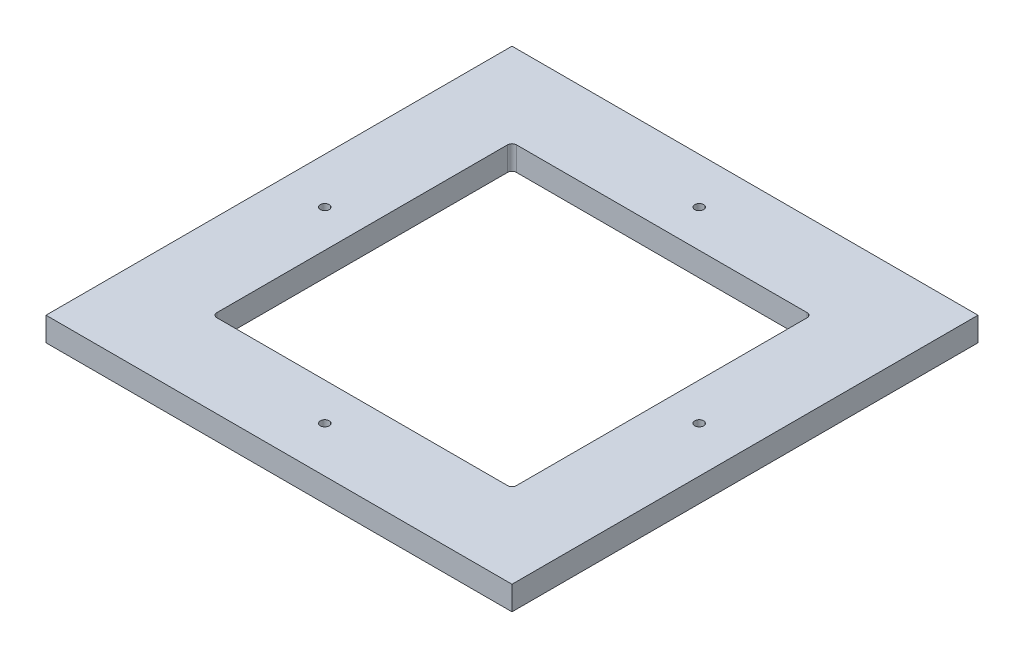
ISO-10303-21;
HEADER;
FILE_DESCRIPTION(('STEP AP214'),'2;1');
FILE_NAME('part.step','',(''),(''),'','','');
FILE_SCHEMA(('AUTOMOTIVE_DESIGN { 1 0 10303 214 1 1 1 1 }'));
ENDSEC;
DATA;
#1=APPLICATION_CONTEXT('core data for automotive mechanical design processes');
#2=APPLICATION_PROTOCOL_DEFINITION('international standard','automotive_design',2000,#1);
#3=PRODUCT_CONTEXT('',#1,'mechanical');
#4=PRODUCT('Part','Part','',(#3));
#5=PRODUCT_RELATED_PRODUCT_CATEGORY('part','',(#4));
#6=PRODUCT_DEFINITION_FORMATION('','',#4);
#7=PRODUCT_DEFINITION_CONTEXT('part definition',#1,'design');
#8=PRODUCT_DEFINITION('design','',#6,#7);
#9=PRODUCT_DEFINITION_SHAPE('','',#8);
#10=(LENGTH_UNIT() NAMED_UNIT(*) SI_UNIT(.MILLI.,.METRE.));
#11=(NAMED_UNIT(*) PLANE_ANGLE_UNIT() SI_UNIT($,.RADIAN.));
#12=(NAMED_UNIT(*) SI_UNIT($,.STERADIAN.) SOLID_ANGLE_UNIT());
#13=UNCERTAINTY_MEASURE_WITH_UNIT(LENGTH_MEASURE(1.E-05),#10,'distance_accuracy_value','');
#14=(GEOMETRIC_REPRESENTATION_CONTEXT(3) GLOBAL_UNCERTAINTY_ASSIGNED_CONTEXT((#13)) GLOBAL_UNIT_ASSIGNED_CONTEXT((#10,
#11,#12)) REPRESENTATION_CONTEXT('',''));
#15=CARTESIAN_POINT('',(0.,0.,0.));
#16=DIRECTION('',(0.,0.,1.));
#17=DIRECTION('',(1.,0.,0.));
#18=AXIS2_PLACEMENT_3D('',#15,#16,#17);
#19=CARTESIAN_POINT('',(177.8,18.25625,-177.8));
#20=DIRECTION('',(-1.,0.,0.));
#21=DIRECTION('',(0.,0.,1.));
#22=AXIS2_PLACEMENT_3D('',#19,#20,#21);
#23=PLANE('',#22);
#24=DIRECTION('',(0.,0.,-1.));
#25=VECTOR('',#24,1.);
#26=CARTESIAN_POINT('',(177.8,0.,-177.8));
#27=LINE('',#26,#25);
#28=CARTESIAN_POINT('',(177.8,0.,177.8));
#29=VERTEX_POINT('',#28);
#30=CARTESIAN_POINT('',(177.8,0.,-177.8));
#31=VERTEX_POINT('',#30);
#32=EDGE_CURVE('E146',#29,#31,#27,.T.);
#33=ORIENTED_EDGE('',*,*,#32,.T.);
#34=DIRECTION('',(0.,-1.,0.));
#35=VECTOR('',#34,1.);
#36=CARTESIAN_POINT('',(177.8,18.25625,-177.8));
#37=LINE('',#36,#35);
#38=CARTESIAN_POINT('',(177.8,18.25625,-177.8));
#39=VERTEX_POINT('',#38);
#40=EDGE_CURVE('E127',#39,#31,#37,.T.);
#41=ORIENTED_EDGE('',*,*,#40,.F.);
#42=DIRECTION('',(0.,0.,-1.));
#43=VECTOR('',#42,1.);
#44=CARTESIAN_POINT('',(177.8,18.25625,-177.8));
#45=LINE('',#44,#43);
#46=CARTESIAN_POINT('',(177.8,18.25625,177.8));
#47=VERTEX_POINT('',#46);
#48=EDGE_CURVE('E134',#47,#39,#45,.T.);
#49=ORIENTED_EDGE('',*,*,#48,.F.);
#50=DIRECTION('',(0.,-1.,0.));
#51=VECTOR('',#50,1.);
#52=CARTESIAN_POINT('',(177.8,18.25625,177.8));
#53=LINE('',#52,#51);
#54=EDGE_CURVE('E245',#47,#29,#53,.T.);
#55=ORIENTED_EDGE('',*,*,#54,.T.);
#56=EDGE_LOOP('',(#33,#41,#49,#55));
#57=FACE_BOUND('',#56,.T.);
#58=ADVANCED_FACE('F33',(#57),#23,.F.);
#59=CARTESIAN_POINT('',(-177.8,18.25625,-177.8));
#60=DIRECTION('',(0.,0.,1.));
#61=DIRECTION('',(1.,0.,0.));
#62=AXIS2_PLACEMENT_3D('',#59,#60,#61);
#63=PLANE('',#62);
#64=DIRECTION('',(-1.,0.,0.));
#65=VECTOR('',#64,1.);
#66=CARTESIAN_POINT('',(-177.8,0.,-177.8));
#67=LINE('',#66,#65);
#68=CARTESIAN_POINT('',(-177.8,0.,-177.8));
#69=VERTEX_POINT('',#68);
#70=EDGE_CURVE('E247',#31,#69,#67,.T.);
#71=ORIENTED_EDGE('',*,*,#70,.T.);
#72=DIRECTION('',(0.,-1.,0.));
#73=VECTOR('',#72,1.);
#74=CARTESIAN_POINT('',(-177.8,18.25625,-177.8));
#75=LINE('',#74,#73);
#76=CARTESIAN_POINT('',(-177.8,18.25625,-177.8));
#77=VERTEX_POINT('',#76);
#78=EDGE_CURVE('E130',#77,#69,#75,.T.);
#79=ORIENTED_EDGE('',*,*,#78,.F.);
#80=DIRECTION('',(-1.,0.,0.));
#81=VECTOR('',#80,1.);
#82=CARTESIAN_POINT('',(-177.8,18.25625,-177.8));
#83=LINE('',#82,#81);
#84=EDGE_CURVE('E123',#39,#77,#83,.T.);
#85=ORIENTED_EDGE('',*,*,#84,.F.);
#86=ORIENTED_EDGE('',*,*,#40,.T.);
#87=EDGE_LOOP('',(#71,#79,#85,#86));
#88=FACE_BOUND('',#87,.T.);
#89=ADVANCED_FACE('F125',(#88),#63,.F.);
#90=CARTESIAN_POINT('',(-177.8,18.25625,-177.8));
#91=DIRECTION('',(1.,0.,0.));
#92=DIRECTION('',(0.,0.,-1.));
#93=AXIS2_PLACEMENT_3D('',#90,#91,#92);
#94=PLANE('',#93);
#95=DIRECTION('',(0.,0.,1.));
#96=VECTOR('',#95,1.);
#97=CARTESIAN_POINT('',(-177.8,0.,-177.8));
#98=LINE('',#97,#96);
#99=CARTESIAN_POINT('',(-177.8,0.,177.8));
#100=VERTEX_POINT('',#99);
#101=EDGE_CURVE('E249',#69,#100,#98,.T.);
#102=ORIENTED_EDGE('',*,*,#101,.T.);
#103=DIRECTION('',(0.,-1.,0.));
#104=VECTOR('',#103,1.);
#105=CARTESIAN_POINT('',(-177.8,18.25625,177.8));
#106=LINE('',#105,#104);
#107=CARTESIAN_POINT('',(-177.8,18.25625,177.8));
#108=VERTEX_POINT('',#107);
#109=EDGE_CURVE('E151',#108,#100,#106,.T.);
#110=ORIENTED_EDGE('',*,*,#109,.F.);
#111=DIRECTION('',(0.,0.,1.));
#112=VECTOR('',#111,1.);
#113=CARTESIAN_POINT('',(-177.8,18.25625,-177.8));
#114=LINE('',#113,#112);
#115=EDGE_CURVE('E133',#77,#108,#114,.T.);
#116=ORIENTED_EDGE('',*,*,#115,.F.);
#117=ORIENTED_EDGE('',*,*,#78,.T.);
#118=EDGE_LOOP('',(#102,#110,#116,#117));
#119=FACE_BOUND('',#118,.T.);
#120=ADVANCED_FACE('F260',(#119),#94,.F.);
#121=CARTESIAN_POINT('',(-177.8,18.25625,177.8));
#122=DIRECTION('',(0.,0.,-1.));
#123=DIRECTION('',(-1.,0.,0.));
#124=AXIS2_PLACEMENT_3D('',#121,#122,#123);
#125=PLANE('',#124);
#126=DIRECTION('',(1.,0.,0.));
#127=VECTOR('',#126,1.);
#128=CARTESIAN_POINT('',(-177.8,0.,177.8));
#129=LINE('',#128,#127);
#130=EDGE_CURVE('E143',#100,#29,#129,.T.);
#131=ORIENTED_EDGE('',*,*,#130,.T.);
#132=ORIENTED_EDGE('',*,*,#54,.F.);
#133=DIRECTION('',(1.,0.,0.));
#134=VECTOR('',#133,1.);
#135=CARTESIAN_POINT('',(-177.8,18.25625,177.8));
#136=LINE('',#135,#134);
#137=EDGE_CURVE('E139',#108,#47,#136,.T.);
#138=ORIENTED_EDGE('',*,*,#137,.F.);
#139=ORIENTED_EDGE('',*,*,#109,.T.);
#140=EDGE_LOOP('',(#131,#132,#138,#139));
#141=FACE_BOUND('',#140,.T.);
#142=ADVANCED_FACE('F256',(#141),#125,.F.);
#143=CARTESIAN_POINT('',(0.,18.25625,0.));
#144=DIRECTION('',(0.,1.,0.));
#145=DIRECTION('',(0.,0.,1.));
#146=AXIS2_PLACEMENT_3D('',#143,#144,#145);
#147=PLANE('',#146);
#148=DIRECTION('',(0.,0.,1.));
#149=VECTOR('',#148,1.);
#150=CARTESIAN_POINT('',(-114.3,18.25625,114.3));
#151=LINE('',#150,#149);
#152=CARTESIAN_POINT('',(-114.3,18.25625,-110.9218));
#153=VERTEX_POINT('',#152);
#154=CARTESIAN_POINT('',(-114.3,18.25625,110.9218));
#155=VERTEX_POINT('',#154);
#156=EDGE_CURVE('E185',#153,#155,#151,.T.);
#157=ORIENTED_EDGE('',*,*,#156,.F.);
#158=CARTESIAN_POINT('',(-110.9218,18.25625,-110.9218));
#159=DIRECTION('',(0.,1.,0.));
#160=DIRECTION('',(0.,0.,1.));
#161=AXIS2_PLACEMENT_3D('',#158,#159,#160);
#162=CIRCLE('',#161,3.3782);
#163=CARTESIAN_POINT('',(-110.9218,18.25625,-114.3));
#164=VERTEX_POINT('',#163);
#165=EDGE_CURVE('E179',#153,#164,#162,.F.);
#166=ORIENTED_EDGE('',*,*,#165,.T.);
#167=DIRECTION('',(-1.,0.,0.));
#168=VECTOR('',#167,1.);
#169=CARTESIAN_POINT('',(114.3,18.25625,-114.3));
#170=LINE('',#169,#168);
#171=CARTESIAN_POINT('',(110.9218,18.25625,-114.3));
#172=VERTEX_POINT('',#171);
#173=EDGE_CURVE('E209',#172,#164,#170,.T.);
#174=ORIENTED_EDGE('',*,*,#173,.F.);
#175=CARTESIAN_POINT('',(110.9218,18.25625,-110.9218));
#176=DIRECTION('',(0.,1.,0.));
#177=DIRECTION('',(0.,0.,1.));
#178=AXIS2_PLACEMENT_3D('',#175,#176,#177);
#179=CIRCLE('',#178,3.3782);
#180=CARTESIAN_POINT('',(114.3,18.25625,-110.9218));
#181=VERTEX_POINT('',#180);
#182=EDGE_CURVE('E171',#172,#181,#179,.F.);
#183=ORIENTED_EDGE('',*,*,#182,.T.);
#184=DIRECTION('',(0.,0.,-1.));
#185=VECTOR('',#184,1.);
#186=CARTESIAN_POINT('',(114.3,18.25625,114.3));
#187=LINE('',#186,#185);
#188=CARTESIAN_POINT('',(114.3,18.25625,110.9218));
#189=VERTEX_POINT('',#188);
#190=EDGE_CURVE('E215',#189,#181,#187,.T.);
#191=ORIENTED_EDGE('',*,*,#190,.F.);
#192=CARTESIAN_POINT('',(110.9218,18.25625,110.9218));
#193=DIRECTION('',(0.,1.,0.));
#194=DIRECTION('',(0.,0.,1.));
#195=AXIS2_PLACEMENT_3D('',#192,#193,#194);
#196=CIRCLE('',#195,3.3782);
#197=CARTESIAN_POINT('',(110.9218,18.25625,114.3));
#198=VERTEX_POINT('',#197);
#199=EDGE_CURVE('E175',#189,#198,#196,.F.);
#200=ORIENTED_EDGE('',*,*,#199,.T.);
#201=DIRECTION('',(1.,0.,0.));
#202=VECTOR('',#201,1.);
#203=CARTESIAN_POINT('',(114.3,18.25625,114.3));
#204=LINE('',#203,#202);
#205=CARTESIAN_POINT('',(-110.9218,18.25625,114.3));
#206=VERTEX_POINT('',#205);
#207=EDGE_CURVE('E187',#206,#198,#204,.T.);
#208=ORIENTED_EDGE('',*,*,#207,.F.);
#209=CARTESIAN_POINT('',(-110.9218,18.25625,110.9218));
#210=DIRECTION('',(0.,1.,0.));
#211=DIRECTION('',(0.,0.,1.));
#212=AXIS2_PLACEMENT_3D('',#209,#210,#211);
#213=CIRCLE('',#212,3.3782);
#214=EDGE_CURVE('E41',#206,#155,#213,.F.);
#215=ORIENTED_EDGE('',*,*,#214,.T.);
#216=EDGE_LOOP('',(#157,#166,#174,#183,#191,#200,#208,#215));
#217=FACE_BOUND('',#216,.T.);
#218=CARTESIAN_POINT('',(0.,18.25625,-142.875));
#219=DIRECTION('',(0.,1.,0.));
#220=DIRECTION('',(0.,0.,1.));
#221=AXIS2_PLACEMENT_3D('',#218,#219,#220);
#222=CIRCLE('',#221,3.3782);
#223=CARTESIAN_POINT('',(0.,18.25625,-139.4968));
#224=VERTEX_POINT('',#223);
#225=EDGE_CURVE('E212',#224,#224,#222,.T.);
#226=ORIENTED_EDGE('',*,*,#225,.F.);
#227=EDGE_LOOP('',(#226));
#228=FACE_BOUND('',#227,.T.);
#229=CARTESIAN_POINT('',(-142.875,18.25625,0.));
#230=DIRECTION('',(0.,1.,0.));
#231=DIRECTION('',(0.,0.,1.));
#232=AXIS2_PLACEMENT_3D('',#229,#230,#231);
#233=CIRCLE('',#232,3.3782);
#234=CARTESIAN_POINT('',(-142.875,18.25625,3.3782));
#235=VERTEX_POINT('',#234);
#236=EDGE_CURVE('E225',#235,#235,#233,.T.);
#237=ORIENTED_EDGE('',*,*,#236,.F.);
#238=EDGE_LOOP('',(#237));
#239=FACE_BOUND('',#238,.T.);
#240=CARTESIAN_POINT('',(0.,18.25625,142.875));
#241=DIRECTION('',(0.,1.,0.));
#242=DIRECTION('',(0.,0.,1.));
#243=AXIS2_PLACEMENT_3D('',#240,#241,#242);
#244=CIRCLE('',#243,3.3782);
#245=CARTESIAN_POINT('',(0.,18.25625,146.2532));
#246=VERTEX_POINT('',#245);
#247=EDGE_CURVE('E231',#246,#246,#244,.T.);
#248=ORIENTED_EDGE('',*,*,#247,.F.);
#249=EDGE_LOOP('',(#248));
#250=FACE_BOUND('',#249,.T.);
#251=CARTESIAN_POINT('',(142.875,18.25625,0.));
#252=DIRECTION('',(0.,1.,0.));
#253=DIRECTION('',(0.,0.,1.));
#254=AXIS2_PLACEMENT_3D('',#251,#252,#253);
#255=CIRCLE('',#254,3.3782);
#256=CARTESIAN_POINT('',(142.875,18.25625,3.37819999999995));
#257=VERTEX_POINT('',#256);
#258=EDGE_CURVE('E237',#257,#257,#255,.T.);
#259=ORIENTED_EDGE('',*,*,#258,.F.);
#260=EDGE_LOOP('',(#259));
#261=FACE_BOUND('',#260,.T.);
#262=ORIENTED_EDGE('',*,*,#48,.T.);
#263=ORIENTED_EDGE('',*,*,#84,.T.);
#264=ORIENTED_EDGE('',*,*,#115,.T.);
#265=ORIENTED_EDGE('',*,*,#137,.T.);
#266=EDGE_LOOP('',(#262,#263,#264,#265));
#267=FACE_BOUND('',#266,.T.);
#268=ADVANCED_FACE('F137',(#217,#228,#239,#250,#261,#267),#147,.T.);
#269=CARTESIAN_POINT('',(0.,0.,0.));
#270=DIRECTION('',(0.,1.,0.));
#271=DIRECTION('',(0.,0.,1.));
#272=AXIS2_PLACEMENT_3D('',#269,#270,#271);
#273=PLANE('',#272);
#274=DIRECTION('',(0.,0.,-1.));
#275=VECTOR('',#274,1.);
#276=CARTESIAN_POINT('',(114.3,0.,114.3));
#277=LINE('',#276,#275);
#278=CARTESIAN_POINT('',(114.3,0.,110.9218));
#279=VERTEX_POINT('',#278);
#280=CARTESIAN_POINT('',(114.3,0.,-110.9218));
#281=VERTEX_POINT('',#280);
#282=EDGE_CURVE('E205',#279,#281,#277,.T.);
#283=ORIENTED_EDGE('',*,*,#282,.T.);
#284=CARTESIAN_POINT('',(110.9218,0.,-110.9218));
#285=DIRECTION('',(0.,1.,0.));
#286=DIRECTION('',(0.,0.,1.));
#287=AXIS2_PLACEMENT_3D('',#284,#285,#286);
#288=CIRCLE('',#287,3.3782);
#289=CARTESIAN_POINT('',(110.9218,0.,-114.3));
#290=VERTEX_POINT('',#289);
#291=EDGE_CURVE('E173',#281,#290,#288,.T.);
#292=ORIENTED_EDGE('',*,*,#291,.T.);
#293=DIRECTION('',(-1.,0.,0.));
#294=VECTOR('',#293,1.);
#295=CARTESIAN_POINT('',(114.3,0.,-114.3));
#296=LINE('',#295,#294);
#297=CARTESIAN_POINT('',(-110.9218,0.,-114.3));
#298=VERTEX_POINT('',#297);
#299=EDGE_CURVE('E207',#290,#298,#296,.T.);
#300=ORIENTED_EDGE('',*,*,#299,.T.);
#301=CARTESIAN_POINT('',(-110.9218,0.,-110.9218));
#302=DIRECTION('',(0.,1.,0.));
#303=DIRECTION('',(0.,0.,1.));
#304=AXIS2_PLACEMENT_3D('',#301,#302,#303);
#305=CIRCLE('',#304,3.3782);
#306=CARTESIAN_POINT('',(-114.3,0.,-110.9218));
#307=VERTEX_POINT('',#306);
#308=EDGE_CURVE('E55',#298,#307,#305,.T.);
#309=ORIENTED_EDGE('',*,*,#308,.T.);
#310=DIRECTION('',(0.,0.,1.));
#311=VECTOR('',#310,1.);
#312=CARTESIAN_POINT('',(-114.3,0.,114.3));
#313=LINE('',#312,#311);
#314=CARTESIAN_POINT('',(-114.3,0.,110.9218));
#315=VERTEX_POINT('',#314);
#316=EDGE_CURVE('E201',#307,#315,#313,.T.);
#317=ORIENTED_EDGE('',*,*,#316,.T.);
#318=CARTESIAN_POINT('',(-110.9218,0.,110.9218));
#319=DIRECTION('',(0.,1.,0.));
#320=DIRECTION('',(0.,0.,1.));
#321=AXIS2_PLACEMENT_3D('',#318,#319,#320);
#322=CIRCLE('',#321,3.3782);
#323=CARTESIAN_POINT('',(-110.9218,0.,114.3));
#324=VERTEX_POINT('',#323);
#325=EDGE_CURVE('E11',#315,#324,#322,.T.);
#326=ORIENTED_EDGE('',*,*,#325,.T.);
#327=DIRECTION('',(1.,0.,0.));
#328=VECTOR('',#327,1.);
#329=CARTESIAN_POINT('',(114.3,0.,114.3));
#330=LINE('',#329,#328);
#331=CARTESIAN_POINT('',(110.9218,0.,114.3));
#332=VERTEX_POINT('',#331);
#333=EDGE_CURVE('E199',#324,#332,#330,.T.);
#334=ORIENTED_EDGE('',*,*,#333,.T.);
#335=CARTESIAN_POINT('',(110.9218,0.,110.9218));
#336=DIRECTION('',(0.,1.,0.));
#337=DIRECTION('',(0.,0.,1.));
#338=AXIS2_PLACEMENT_3D('',#335,#336,#337);
#339=CIRCLE('',#338,3.3782);
#340=EDGE_CURVE('E177',#332,#279,#339,.T.);
#341=ORIENTED_EDGE('',*,*,#340,.T.);
#342=EDGE_LOOP('',(#283,#292,#300,#309,#317,#326,#334,#341));
#343=FACE_BOUND('',#342,.T.);
#344=CARTESIAN_POINT('',(0.,0.,-142.875));
#345=DIRECTION('',(0.,1.,0.));
#346=DIRECTION('',(0.,0.,1.));
#347=AXIS2_PLACEMENT_3D('',#344,#345,#346);
#348=CIRCLE('',#347,3.3782);
#349=CARTESIAN_POINT('',(0.,0.,-139.4968));
#350=VERTEX_POINT('',#349);
#351=EDGE_CURVE('E222',#350,#350,#348,.T.);
#352=ORIENTED_EDGE('',*,*,#351,.T.);
#353=EDGE_LOOP('',(#352));
#354=FACE_BOUND('',#353,.T.);
#355=CARTESIAN_POINT('',(-142.875,0.,0.));
#356=DIRECTION('',(0.,1.,0.));
#357=DIRECTION('',(0.,0.,1.));
#358=AXIS2_PLACEMENT_3D('',#355,#356,#357);
#359=CIRCLE('',#358,3.3782);
#360=CARTESIAN_POINT('',(-142.875,0.,3.3782));
#361=VERTEX_POINT('',#360);
#362=EDGE_CURVE('E228',#361,#361,#359,.T.);
#363=ORIENTED_EDGE('',*,*,#362,.T.);
#364=EDGE_LOOP('',(#363));
#365=FACE_BOUND('',#364,.T.);
#366=CARTESIAN_POINT('',(0.,0.,142.875));
#367=DIRECTION('',(0.,1.,0.));
#368=DIRECTION('',(0.,0.,1.));
#369=AXIS2_PLACEMENT_3D('',#366,#367,#368);
#370=CIRCLE('',#369,3.3782);
#371=CARTESIAN_POINT('',(0.,0.,146.2532));
#372=VERTEX_POINT('',#371);
#373=EDGE_CURVE('E234',#372,#372,#370,.T.);
#374=ORIENTED_EDGE('',*,*,#373,.T.);
#375=EDGE_LOOP('',(#374));
#376=FACE_BOUND('',#375,.T.);
#377=CARTESIAN_POINT('',(142.875,0.,0.));
#378=DIRECTION('',(0.,1.,0.));
#379=DIRECTION('',(0.,0.,1.));
#380=AXIS2_PLACEMENT_3D('',#377,#378,#379);
#381=CIRCLE('',#380,3.3782);
#382=CARTESIAN_POINT('',(142.875,0.,3.37819999999995));
#383=VERTEX_POINT('',#382);
#384=EDGE_CURVE('E240',#383,#383,#381,.T.);
#385=ORIENTED_EDGE('',*,*,#384,.T.);
#386=EDGE_LOOP('',(#385));
#387=FACE_BOUND('',#386,.T.);
#388=ORIENTED_EDGE('',*,*,#32,.F.);
#389=ORIENTED_EDGE('',*,*,#130,.F.);
#390=ORIENTED_EDGE('',*,*,#101,.F.);
#391=ORIENTED_EDGE('',*,*,#70,.F.);
#392=EDGE_LOOP('',(#388,#389,#390,#391));
#393=FACE_BOUND('',#392,.T.);
#394=ADVANCED_FACE('F197',(#343,#354,#365,#376,#387,#393),#273,.F.);
#395=CARTESIAN_POINT('',(142.875,18.25625,0.));
#396=DIRECTION('',(0.,1.,0.));
#397=DIRECTION('',(0.,0.,1.));
#398=AXIS2_PLACEMENT_3D('',#395,#396,#397);
#399=CYLINDRICAL_SURFACE('',#398,3.3782);
#400=ORIENTED_EDGE('',*,*,#384,.F.);
#401=EDGE_LOOP('',(#400));
#402=FACE_BOUND('',#401,.T.);
#403=ORIENTED_EDGE('',*,*,#258,.T.);
#404=EDGE_LOOP('',(#403));
#405=FACE_BOUND('',#404,.T.);
#406=ADVANCED_FACE('F322',(#402,#405),#399,.F.);
#407=CARTESIAN_POINT('',(0.,18.25625,142.875));
#408=DIRECTION('',(0.,1.,0.));
#409=DIRECTION('',(0.,0.,1.));
#410=AXIS2_PLACEMENT_3D('',#407,#408,#409);
#411=CYLINDRICAL_SURFACE('',#410,3.3782);
#412=ORIENTED_EDGE('',*,*,#373,.F.);
#413=EDGE_LOOP('',(#412));
#414=FACE_BOUND('',#413,.T.);
#415=ORIENTED_EDGE('',*,*,#247,.T.);
#416=EDGE_LOOP('',(#415));
#417=FACE_BOUND('',#416,.T.);
#418=ADVANCED_FACE('F318',(#414,#417),#411,.F.);
#419=CARTESIAN_POINT('',(-142.875,18.25625,0.));
#420=DIRECTION('',(0.,1.,0.));
#421=DIRECTION('',(0.,0.,1.));
#422=AXIS2_PLACEMENT_3D('',#419,#420,#421);
#423=CYLINDRICAL_SURFACE('',#422,3.3782);
#424=ORIENTED_EDGE('',*,*,#362,.F.);
#425=EDGE_LOOP('',(#424));
#426=FACE_BOUND('',#425,.T.);
#427=ORIENTED_EDGE('',*,*,#236,.T.);
#428=EDGE_LOOP('',(#427));
#429=FACE_BOUND('',#428,.T.);
#430=ADVANCED_FACE('F314',(#426,#429),#423,.F.);
#431=CARTESIAN_POINT('',(0.,18.25625,-142.875));
#432=DIRECTION('',(0.,1.,0.));
#433=DIRECTION('',(0.,0.,1.));
#434=AXIS2_PLACEMENT_3D('',#431,#432,#433);
#435=CYLINDRICAL_SURFACE('',#434,3.3782);
#436=ORIENTED_EDGE('',*,*,#351,.F.);
#437=EDGE_LOOP('',(#436));
#438=FACE_BOUND('',#437,.T.);
#439=ORIENTED_EDGE('',*,*,#225,.T.);
#440=EDGE_LOOP('',(#439));
#441=FACE_BOUND('',#440,.T.);
#442=ADVANCED_FACE('F311',(#438,#441),#435,.F.);
#443=CARTESIAN_POINT('',(-114.3,0.,114.3));
#444=DIRECTION('',(-1.,0.,0.));
#445=DIRECTION('',(0.,0.,1.));
#446=AXIS2_PLACEMENT_3D('',#443,#444,#445);
#447=PLANE('',#446);
#448=ORIENTED_EDGE('',*,*,#316,.F.);
#449=DIRECTION('',(0.,1.,0.));
#450=VECTOR('',#449,1.);
#451=CARTESIAN_POINT('',(-114.3,18.25625,-110.9218));
#452=LINE('',#451,#450);
#453=EDGE_CURVE('E168',#307,#153,#452,.T.);
#454=ORIENTED_EDGE('',*,*,#453,.T.);
#455=ORIENTED_EDGE('',*,*,#156,.T.);
#456=DIRECTION('',(0.,1.,0.));
#457=VECTOR('',#456,1.);
#458=CARTESIAN_POINT('',(-114.3,0.,110.9218));
#459=LINE('',#458,#457);
#460=EDGE_CURVE('E48',#155,#315,#459,.F.);
#461=ORIENTED_EDGE('',*,*,#460,.T.);
#462=EDGE_LOOP('',(#448,#454,#455,#461));
#463=FACE_BOUND('',#462,.T.);
#464=ADVANCED_FACE('F190',(#463),#447,.F.);
#465=CARTESIAN_POINT('',(114.3,0.,-114.3));
#466=DIRECTION('',(0.,0.,-1.));
#467=DIRECTION('',(-1.,0.,0.));
#468=AXIS2_PLACEMENT_3D('',#465,#466,#467);
#469=PLANE('',#468);
#470=ORIENTED_EDGE('',*,*,#299,.F.);
#471=DIRECTION('',(0.,1.,0.));
#472=VECTOR('',#471,1.);
#473=CARTESIAN_POINT('',(110.9218,18.25625,-114.3));
#474=LINE('',#473,#472);
#475=EDGE_CURVE('E149',#290,#172,#474,.T.);
#476=ORIENTED_EDGE('',*,*,#475,.T.);
#477=ORIENTED_EDGE('',*,*,#173,.T.);
#478=DIRECTION('',(0.,1.,0.));
#479=VECTOR('',#478,1.);
#480=CARTESIAN_POINT('',(-110.9218,0.,-114.3));
#481=LINE('',#480,#479);
#482=EDGE_CURVE('E147',#164,#298,#481,.F.);
#483=ORIENTED_EDGE('',*,*,#482,.T.);
#484=EDGE_LOOP('',(#470,#476,#477,#483));
#485=FACE_BOUND('',#484,.T.);
#486=ADVANCED_FACE('F291',(#485),#469,.F.);
#487=CARTESIAN_POINT('',(114.3,0.,114.3));
#488=DIRECTION('',(1.,0.,0.));
#489=DIRECTION('',(0.,0.,-1.));
#490=AXIS2_PLACEMENT_3D('',#487,#488,#489);
#491=PLANE('',#490);
#492=ORIENTED_EDGE('',*,*,#190,.T.);
#493=DIRECTION('',(0.,1.,0.));
#494=VECTOR('',#493,1.);
#495=CARTESIAN_POINT('',(114.3,0.,-110.9218));
#496=LINE('',#495,#494);
#497=EDGE_CURVE('E160',#181,#281,#496,.F.);
#498=ORIENTED_EDGE('',*,*,#497,.T.);
#499=ORIENTED_EDGE('',*,*,#282,.F.);
#500=DIRECTION('',(0.,1.,0.));
#501=VECTOR('',#500,1.);
#502=CARTESIAN_POINT('',(114.3,18.25625,110.9218));
#503=LINE('',#502,#501);
#504=EDGE_CURVE('E157',#279,#189,#503,.T.);
#505=ORIENTED_EDGE('',*,*,#504,.T.);
#506=EDGE_LOOP('',(#492,#498,#499,#505));
#507=FACE_BOUND('',#506,.T.);
#508=ADVANCED_FACE('F297',(#507),#491,.F.);
#509=CARTESIAN_POINT('',(114.3,0.,114.3));
#510=DIRECTION('',(0.,0.,1.));
#511=DIRECTION('',(1.,0.,0.));
#512=AXIS2_PLACEMENT_3D('',#509,#510,#511);
#513=PLANE('',#512);
#514=ORIENTED_EDGE('',*,*,#207,.T.);
#515=DIRECTION('',(0.,1.,0.));
#516=VECTOR('',#515,1.);
#517=CARTESIAN_POINT('',(110.9218,0.,114.3));
#518=LINE('',#517,#516);
#519=EDGE_CURVE('E165',#198,#332,#518,.F.);
#520=ORIENTED_EDGE('',*,*,#519,.T.);
#521=ORIENTED_EDGE('',*,*,#333,.F.);
#522=DIRECTION('',(0.,1.,0.));
#523=VECTOR('',#522,1.);
#524=CARTESIAN_POINT('',(-110.9218,18.25625,114.3));
#525=LINE('',#524,#523);
#526=EDGE_CURVE('E162',#324,#206,#525,.T.);
#527=ORIENTED_EDGE('',*,*,#526,.T.);
#528=EDGE_LOOP('',(#514,#520,#521,#527));
#529=FACE_BOUND('',#528,.T.);
#530=ADVANCED_FACE('F203',(#529),#513,.F.);
#531=CARTESIAN_POINT('',(110.9218,0.,-110.9218));
#532=DIRECTION('',(0.,-1.,0.));
#533=DIRECTION('',(0.,0.,-1.));
#534=AXIS2_PLACEMENT_3D('',#531,#532,#533);
#535=CYLINDRICAL_SURFACE('',#534,3.3782);
#536=ORIENTED_EDGE('',*,*,#291,.F.);
#537=ORIENTED_EDGE('',*,*,#497,.F.);
#538=ORIENTED_EDGE('',*,*,#182,.F.);
#539=ORIENTED_EDGE('',*,*,#475,.F.);
#540=EDGE_LOOP('',(#536,#537,#538,#539));
#541=FACE_BOUND('',#540,.T.);
#542=ADVANCED_FACE('F274',(#541),#535,.F.);
#543=CARTESIAN_POINT('',(110.9218,0.,110.9218));
#544=DIRECTION('',(0.,-1.,0.));
#545=DIRECTION('',(0.,0.,-1.));
#546=AXIS2_PLACEMENT_3D('',#543,#544,#545);
#547=CYLINDRICAL_SURFACE('',#546,3.3782);
#548=ORIENTED_EDGE('',*,*,#340,.F.);
#549=ORIENTED_EDGE('',*,*,#519,.F.);
#550=ORIENTED_EDGE('',*,*,#199,.F.);
#551=ORIENTED_EDGE('',*,*,#504,.F.);
#552=EDGE_LOOP('',(#548,#549,#550,#551));
#553=FACE_BOUND('',#552,.T.);
#554=ADVANCED_FACE('F277',(#553),#547,.F.);
#555=CARTESIAN_POINT('',(-110.9218,0.,-110.9218));
#556=DIRECTION('',(0.,-1.,0.));
#557=DIRECTION('',(0.,0.,-1.));
#558=AXIS2_PLACEMENT_3D('',#555,#556,#557);
#559=CYLINDRICAL_SURFACE('',#558,3.3782);
#560=ORIENTED_EDGE('',*,*,#308,.F.);
#561=ORIENTED_EDGE('',*,*,#482,.F.);
#562=ORIENTED_EDGE('',*,*,#165,.F.);
#563=ORIENTED_EDGE('',*,*,#453,.F.);
#564=EDGE_LOOP('',(#560,#561,#562,#563));
#565=FACE_BOUND('',#564,.T.);
#566=ADVANCED_FACE('F280',(#565),#559,.F.);
#567=CARTESIAN_POINT('',(-110.9218,0.,110.9218));
#568=DIRECTION('',(0.,-1.,0.));
#569=DIRECTION('',(0.,0.,-1.));
#570=AXIS2_PLACEMENT_3D('',#567,#568,#569);
#571=CYLINDRICAL_SURFACE('',#570,3.3782);
#572=ORIENTED_EDGE('',*,*,#325,.F.);
#573=ORIENTED_EDGE('',*,*,#460,.F.);
#574=ORIENTED_EDGE('',*,*,#214,.F.);
#575=ORIENTED_EDGE('',*,*,#526,.F.);
#576=EDGE_LOOP('',(#572,#573,#574,#575));
#577=FACE_BOUND('',#576,.T.);
#578=ADVANCED_FACE('F35',(#577),#571,.F.);
#579=CLOSED_SHELL('',(#58,#89,#120,#142,#268,#394,#406,#418,#430,#442,#464,#486,#508,#530,#542,
#554,#566,#578));
#580=MANIFOLD_SOLID_BREP('B2',#579);
#581=ADVANCED_BREP_SHAPE_REPRESENTATION('',(#18,#580),#14);
#582=SHAPE_DEFINITION_REPRESENTATION(#9,#581);
ENDSEC;
END-ISO-10303-21;
